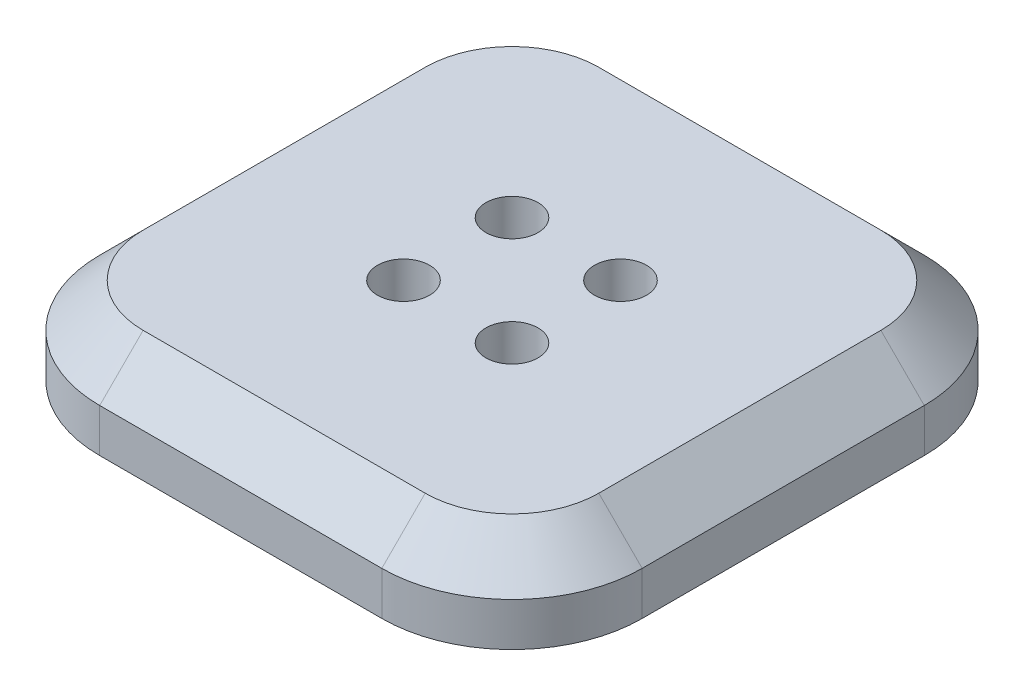
ISO-10303-21;
HEADER;
FILE_DESCRIPTION(('STEP AP214'),'2;1');
FILE_NAME('part.step','',(''),(''),'','','');
FILE_SCHEMA(('AUTOMOTIVE_DESIGN { 1 0 10303 214 1 1 1 1 }'));
ENDSEC;
DATA;
#1=APPLICATION_CONTEXT('core data for automotive mechanical design processes');
#2=APPLICATION_PROTOCOL_DEFINITION('international standard','automotive_design',2000,#1);
#3=PRODUCT_CONTEXT('',#1,'mechanical');
#4=PRODUCT('Part','Part','',(#3));
#5=PRODUCT_RELATED_PRODUCT_CATEGORY('part','',(#4));
#6=PRODUCT_DEFINITION_FORMATION('','',#4);
#7=PRODUCT_DEFINITION_CONTEXT('part definition',#1,'design');
#8=PRODUCT_DEFINITION('design','',#6,#7);
#9=PRODUCT_DEFINITION_SHAPE('','',#8);
#10=(LENGTH_UNIT() NAMED_UNIT(*) SI_UNIT(.MILLI.,.METRE.));
#11=(NAMED_UNIT(*) PLANE_ANGLE_UNIT() SI_UNIT($,.RADIAN.));
#12=(NAMED_UNIT(*) SI_UNIT($,.STERADIAN.) SOLID_ANGLE_UNIT());
#13=UNCERTAINTY_MEASURE_WITH_UNIT(LENGTH_MEASURE(1.E-05),#10,'distance_accuracy_value','');
#14=(GEOMETRIC_REPRESENTATION_CONTEXT(3) GLOBAL_UNCERTAINTY_ASSIGNED_CONTEXT((#13)) GLOBAL_UNIT_ASSIGNED_CONTEXT((#10,
#11,#12)) REPRESENTATION_CONTEXT('',''));
#15=CARTESIAN_POINT('',(0.,0.,0.));
#16=DIRECTION('',(0.,0.,1.));
#17=DIRECTION('',(1.,0.,0.));
#18=AXIS2_PLACEMENT_3D('',#15,#16,#17);
#19=CARTESIAN_POINT('',(62.5,20.,62.5));
#20=DIRECTION('',(-1.,0.,0.));
#21=DIRECTION('',(0.,0.,1.));
#22=AXIS2_PLACEMENT_3D('',#19,#20,#21);
#23=PLANE('',#22);
#24=DIRECTION('',(0.,-1.,0.));
#25=VECTOR('',#24,1.);
#26=CARTESIAN_POINT('',(62.5,20.,-32.5));
#27=LINE('',#26,#25);
#28=CARTESIAN_POINT('',(62.5,0.,-32.5));
#29=VERTEX_POINT('',#28);
#30=CARTESIAN_POINT('',(62.5,9.99999999999994,-32.5));
#31=VERTEX_POINT('',#30);
#32=EDGE_CURVE('E251',#29,#31,#27,.F.);
#33=ORIENTED_EDGE('',*,*,#32,.T.);
#34=DIRECTION('',(0.,0.,1.));
#35=VECTOR('',#34,1.);
#36=CARTESIAN_POINT('',(62.5,9.99999999999994,62.5));
#37=LINE('',#36,#35);
#38=CARTESIAN_POINT('',(62.5,9.99999999999995,32.5));
#39=VERTEX_POINT('',#38);
#40=EDGE_CURVE('E276',#31,#39,#37,.T.);
#41=ORIENTED_EDGE('',*,*,#40,.T.);
#42=DIRECTION('',(0.,-1.,0.));
#43=VECTOR('',#42,1.);
#44=CARTESIAN_POINT('',(62.5,20.,32.5));
#45=LINE('',#44,#43);
#46=CARTESIAN_POINT('',(62.5,0.,32.5));
#47=VERTEX_POINT('',#46);
#48=EDGE_CURVE('E249',#39,#47,#45,.T.);
#49=ORIENTED_EDGE('',*,*,#48,.T.);
#50=DIRECTION('',(0.,0.,-1.));
#51=VECTOR('',#50,1.);
#52=CARTESIAN_POINT('',(62.5,0.,62.5));
#53=LINE('',#52,#51);
#54=EDGE_CURVE('E216',#47,#29,#53,.T.);
#55=ORIENTED_EDGE('',*,*,#54,.T.);
#56=EDGE_LOOP('',(#33,#41,#49,#55));
#57=FACE_BOUND('',#56,.T.);
#58=ADVANCED_FACE('F45',(#57),#23,.F.);
#59=CARTESIAN_POINT('',(-62.5,20.,-62.5));
#60=DIRECTION('',(0.,0.,1.));
#61=DIRECTION('',(1.,0.,0.));
#62=AXIS2_PLACEMENT_3D('',#59,#60,#61);
#63=PLANE('',#62);
#64=DIRECTION('',(0.,-1.,0.));
#65=VECTOR('',#64,1.);
#66=CARTESIAN_POINT('',(-32.5,20.,-62.5));
#67=LINE('',#66,#65);
#68=CARTESIAN_POINT('',(-32.5,0.,-62.5));
#69=VERTEX_POINT('',#68);
#70=CARTESIAN_POINT('',(-32.5,9.99999999999995,-62.5));
#71=VERTEX_POINT('',#70);
#72=EDGE_CURVE('E242',#69,#71,#67,.F.);
#73=ORIENTED_EDGE('',*,*,#72,.T.);
#74=DIRECTION('',(1.,0.,0.));
#75=VECTOR('',#74,1.);
#76=CARTESIAN_POINT('',(-62.5,9.99999999999994,-62.5));
#77=LINE('',#76,#75);
#78=CARTESIAN_POINT('',(32.5,9.99999999999994,-62.5));
#79=VERTEX_POINT('',#78);
#80=EDGE_CURVE('E274',#71,#79,#77,.T.);
#81=ORIENTED_EDGE('',*,*,#80,.T.);
#82=DIRECTION('',(0.,-1.,0.));
#83=VECTOR('',#82,1.);
#84=CARTESIAN_POINT('',(32.5,20.,-62.5));
#85=LINE('',#84,#83);
#86=CARTESIAN_POINT('',(32.5,0.,-62.5));
#87=VERTEX_POINT('',#86);
#88=EDGE_CURVE('E240',#79,#87,#85,.T.);
#89=ORIENTED_EDGE('',*,*,#88,.T.);
#90=DIRECTION('',(-1.,0.,0.));
#91=VECTOR('',#90,1.);
#92=CARTESIAN_POINT('',(-62.5,0.,-62.5));
#93=LINE('',#92,#91);
#94=EDGE_CURVE('E219',#87,#69,#93,.T.);
#95=ORIENTED_EDGE('',*,*,#94,.T.);
#96=EDGE_LOOP('',(#73,#81,#89,#95));
#97=FACE_BOUND('',#96,.T.);
#98=ADVANCED_FACE('F361',(#97),#63,.F.);
#99=CARTESIAN_POINT('',(-62.5,20.,62.5));
#100=DIRECTION('',(1.,0.,0.));
#101=DIRECTION('',(0.,0.,-1.));
#102=AXIS2_PLACEMENT_3D('',#99,#100,#101);
#103=PLANE('',#102);
#104=DIRECTION('',(0.,-1.,0.));
#105=VECTOR('',#104,1.);
#106=CARTESIAN_POINT('',(-62.5,20.,32.5));
#107=LINE('',#106,#105);
#108=CARTESIAN_POINT('',(-62.5,0.,32.5));
#109=VERTEX_POINT('',#108);
#110=CARTESIAN_POINT('',(-62.5,9.99999999999995,32.5));
#111=VERTEX_POINT('',#110);
#112=EDGE_CURVE('E228',#109,#111,#107,.F.);
#113=ORIENTED_EDGE('',*,*,#112,.T.);
#114=DIRECTION('',(0.,0.,-1.));
#115=VECTOR('',#114,1.);
#116=CARTESIAN_POINT('',(-62.5,9.99999999999994,62.5));
#117=LINE('',#116,#115);
#118=CARTESIAN_POINT('',(-62.5,9.99999999999994,-32.5));
#119=VERTEX_POINT('',#118);
#120=EDGE_CURVE('E282',#111,#119,#117,.T.);
#121=ORIENTED_EDGE('',*,*,#120,.T.);
#122=DIRECTION('',(0.,-1.,0.));
#123=VECTOR('',#122,1.);
#124=CARTESIAN_POINT('',(-62.5,20.,-32.5));
#125=LINE('',#124,#123);
#126=CARTESIAN_POINT('',(-62.5,0.,-32.5));
#127=VERTEX_POINT('',#126);
#128=EDGE_CURVE('E230',#119,#127,#125,.T.);
#129=ORIENTED_EDGE('',*,*,#128,.T.);
#130=DIRECTION('',(0.,0.,1.));
#131=VECTOR('',#130,1.);
#132=CARTESIAN_POINT('',(-62.5,0.,62.5));
#133=LINE('',#132,#131);
#134=EDGE_CURVE('E222',#127,#109,#133,.T.);
#135=ORIENTED_EDGE('',*,*,#134,.T.);
#136=EDGE_LOOP('',(#113,#121,#129,#135));
#137=FACE_BOUND('',#136,.T.);
#138=ADVANCED_FACE('F318',(#137),#103,.F.);
#139=CARTESIAN_POINT('',(-62.5,20.,62.5));
#140=DIRECTION('',(0.,0.,-1.));
#141=DIRECTION('',(-1.,0.,0.));
#142=AXIS2_PLACEMENT_3D('',#139,#140,#141);
#143=PLANE('',#142);
#144=DIRECTION('',(0.,-1.,0.));
#145=VECTOR('',#144,1.);
#146=CARTESIAN_POINT('',(32.5,20.,62.5));
#147=LINE('',#146,#145);
#148=CARTESIAN_POINT('',(32.5,0.,62.5));
#149=VERTEX_POINT('',#148);
#150=CARTESIAN_POINT('',(32.5,9.99999999999994,62.5));
#151=VERTEX_POINT('',#150);
#152=EDGE_CURVE('E245',#149,#151,#147,.F.);
#153=ORIENTED_EDGE('',*,*,#152,.T.);
#154=DIRECTION('',(-1.,0.,0.));
#155=VECTOR('',#154,1.);
#156=CARTESIAN_POINT('',(-62.5,9.99999999999994,62.5));
#157=LINE('',#156,#155);
#158=CARTESIAN_POINT('',(-32.5,9.99999999999995,62.5));
#159=VERTEX_POINT('',#158);
#160=EDGE_CURVE('E55',#151,#159,#157,.T.);
#161=ORIENTED_EDGE('',*,*,#160,.T.);
#162=DIRECTION('',(0.,-1.,0.));
#163=VECTOR('',#162,1.);
#164=CARTESIAN_POINT('',(-32.5,20.,62.5));
#165=LINE('',#164,#163);
#166=CARTESIAN_POINT('',(-32.5,0.,62.5));
#167=VERTEX_POINT('',#166);
#168=EDGE_CURVE('E247',#159,#167,#165,.T.);
#169=ORIENTED_EDGE('',*,*,#168,.T.);
#170=DIRECTION('',(1.,0.,0.));
#171=VECTOR('',#170,1.);
#172=CARTESIAN_POINT('',(-62.5,0.,62.5));
#173=LINE('',#172,#171);
#174=EDGE_CURVE('E225',#167,#149,#173,.T.);
#175=ORIENTED_EDGE('',*,*,#174,.T.);
#176=EDGE_LOOP('',(#153,#161,#169,#175));
#177=FACE_BOUND('',#176,.T.);
#178=ADVANCED_FACE('F333',(#177),#143,.F.);
#179=CARTESIAN_POINT('',(0.,20.,0.));
#180=DIRECTION('',(0.,-1.,0.));
#181=DIRECTION('',(0.,0.,-1.));
#182=AXIS2_PLACEMENT_3D('',#179,#180,#181);
#183=PLANE('',#182);
#184=CARTESIAN_POINT('',(-12.5,20.,-12.5));
#185=DIRECTION('',(0.,1.,0.));
#186=DIRECTION('',(0.,0.,1.));
#187=AXIS2_PLACEMENT_3D('',#184,#185,#186);
#188=CIRCLE('',#187,6.);
#189=CARTESIAN_POINT('',(-12.5,20.,-6.5));
#190=VERTEX_POINT('',#189);
#191=EDGE_CURVE('E169',#190,#190,#188,.T.);
#192=ORIENTED_EDGE('',*,*,#191,.F.);
#193=EDGE_LOOP('',(#192));
#194=FACE_BOUND('',#193,.T.);
#195=CARTESIAN_POINT('',(12.5,20.,-12.5));
#196=DIRECTION('',(0.,1.,0.));
#197=DIRECTION('',(0.,0.,1.));
#198=AXIS2_PLACEMENT_3D('',#195,#196,#197);
#199=CIRCLE('',#198,6.);
#200=CARTESIAN_POINT('',(12.5,20.,-6.50000000000001));
#201=VERTEX_POINT('',#200);
#202=EDGE_CURVE('E168',#201,#201,#199,.T.);
#203=ORIENTED_EDGE('',*,*,#202,.F.);
#204=EDGE_LOOP('',(#203));
#205=FACE_BOUND('',#204,.T.);
#206=CARTESIAN_POINT('',(12.5,20.,12.5));
#207=DIRECTION('',(0.,1.,0.));
#208=DIRECTION('',(0.,0.,1.));
#209=AXIS2_PLACEMENT_3D('',#206,#207,#208);
#210=CIRCLE('',#209,6.);
#211=CARTESIAN_POINT('',(12.5,20.,18.5));
#212=VERTEX_POINT('',#211);
#213=EDGE_CURVE('E179',#212,#212,#210,.T.);
#214=ORIENTED_EDGE('',*,*,#213,.F.);
#215=EDGE_LOOP('',(#214));
#216=FACE_BOUND('',#215,.T.);
#217=CARTESIAN_POINT('',(-12.5,20.,12.5));
#218=DIRECTION('',(0.,1.,0.));
#219=DIRECTION('',(0.,0.,1.));
#220=AXIS2_PLACEMENT_3D('',#217,#218,#219);
#221=CIRCLE('',#220,6.);
#222=CARTESIAN_POINT('',(-12.5,20.,18.5));
#223=VERTEX_POINT('',#222);
#224=EDGE_CURVE('E185',#223,#223,#221,.T.);
#225=ORIENTED_EDGE('',*,*,#224,.F.);
#226=EDGE_LOOP('',(#225));
#227=FACE_BOUND('',#226,.T.);
#228=DIRECTION('',(0.,0.,-1.));
#229=VECTOR('',#228,1.);
#230=CARTESIAN_POINT('',(52.5,20.,0.));
#231=LINE('',#230,#229);
#232=CARTESIAN_POINT('',(52.5,20.,32.5));
#233=VERTEX_POINT('',#232);
#234=CARTESIAN_POINT('',(52.5,20.,-32.5));
#235=VERTEX_POINT('',#234);
#236=EDGE_CURVE('E264',#233,#235,#231,.T.);
#237=ORIENTED_EDGE('',*,*,#236,.T.);
#238=CARTESIAN_POINT('',(32.5,20.,-32.5));
#239=DIRECTION('',(0.,-1.,0.));
#240=DIRECTION('',(0.,0.,-1.));
#241=AXIS2_PLACEMENT_3D('',#238,#239,#240);
#242=CIRCLE('',#241,20.);
#243=CARTESIAN_POINT('',(32.5,20.,-52.5));
#244=VERTEX_POINT('',#243);
#245=EDGE_CURVE('E268',#235,#244,#242,.F.);
#246=ORIENTED_EDGE('',*,*,#245,.T.);
#247=DIRECTION('',(-1.,0.,0.));
#248=VECTOR('',#247,1.);
#249=CARTESIAN_POINT('',(0.,20.,-52.5));
#250=LINE('',#249,#248);
#251=CARTESIAN_POINT('',(-32.5,20.,-52.5));
#252=VERTEX_POINT('',#251);
#253=EDGE_CURVE('E266',#244,#252,#250,.T.);
#254=ORIENTED_EDGE('',*,*,#253,.T.);
#255=CARTESIAN_POINT('',(-32.5,20.,-32.5));
#256=DIRECTION('',(0.,-1.,0.));
#257=DIRECTION('',(0.,0.,-1.));
#258=AXIS2_PLACEMENT_3D('',#255,#256,#257);
#259=CIRCLE('',#258,20.);
#260=CARTESIAN_POINT('',(-52.5,20.,-32.5));
#261=VERTEX_POINT('',#260);
#262=EDGE_CURVE('E262',#252,#261,#259,.F.);
#263=ORIENTED_EDGE('',*,*,#262,.T.);
#264=DIRECTION('',(0.,0.,1.));
#265=VECTOR('',#264,1.);
#266=CARTESIAN_POINT('',(-52.5,20.,0.));
#267=LINE('',#266,#265);
#268=CARTESIAN_POINT('',(-52.5,20.,32.5));
#269=VERTEX_POINT('',#268);
#270=EDGE_CURVE('E258',#261,#269,#267,.T.);
#271=ORIENTED_EDGE('',*,*,#270,.T.);
#272=CARTESIAN_POINT('',(-32.5,20.,32.5));
#273=DIRECTION('',(0.,-1.,0.));
#274=DIRECTION('',(0.,0.,-1.));
#275=AXIS2_PLACEMENT_3D('',#272,#273,#274);
#276=CIRCLE('',#275,20.);
#277=CARTESIAN_POINT('',(-32.5,20.,52.5));
#278=VERTEX_POINT('',#277);
#279=EDGE_CURVE('E254',#269,#278,#276,.F.);
#280=ORIENTED_EDGE('',*,*,#279,.T.);
#281=DIRECTION('',(1.,0.,0.));
#282=VECTOR('',#281,1.);
#283=CARTESIAN_POINT('',(0.,20.,52.5));
#284=LINE('',#283,#282);
#285=CARTESIAN_POINT('',(32.5,20.,52.5));
#286=VERTEX_POINT('',#285);
#287=EDGE_CURVE('E256',#278,#286,#284,.T.);
#288=ORIENTED_EDGE('',*,*,#287,.T.);
#289=CARTESIAN_POINT('',(32.5,20.,32.5));
#290=DIRECTION('',(0.,-1.,0.));
#291=DIRECTION('',(0.,0.,-1.));
#292=AXIS2_PLACEMENT_3D('',#289,#290,#291);
#293=CIRCLE('',#292,20.);
#294=EDGE_CURVE('E260',#286,#233,#293,.F.);
#295=ORIENTED_EDGE('',*,*,#294,.T.);
#296=EDGE_LOOP('',(#237,#246,#254,#263,#271,#280,#288,#295));
#297=FACE_BOUND('',#296,.T.);
#298=ADVANCED_FACE('F349',(#194,#205,#216,#227,#297),#183,.F.);
#299=CARTESIAN_POINT('',(0.,0.,0.));
#300=DIRECTION('',(0.,-1.,0.));
#301=DIRECTION('',(0.,0.,-1.));
#302=AXIS2_PLACEMENT_3D('',#299,#300,#301);
#303=PLANE('',#302);
#304=CARTESIAN_POINT('',(37.5,0.,-37.5));
#305=DIRECTION('',(0.,-1.,0.));
#306=DIRECTION('',(0.,0.,-1.));
#307=AXIS2_PLACEMENT_3D('',#304,#305,#306);
#308=CIRCLE('',#307,6.);
#309=CARTESIAN_POINT('',(37.5,0.,-43.5));
#310=VERTEX_POINT('',#309);
#311=EDGE_CURVE('E191',#310,#310,#308,.T.);
#312=ORIENTED_EDGE('',*,*,#311,.F.);
#313=EDGE_LOOP('',(#312));
#314=FACE_BOUND('',#313,.T.);
#315=CARTESIAN_POINT('',(-37.5,0.,-37.5));
#316=DIRECTION('',(0.,-1.,0.));
#317=DIRECTION('',(0.,0.,-1.));
#318=AXIS2_PLACEMENT_3D('',#315,#316,#317);
#319=CIRCLE('',#318,6.);
#320=CARTESIAN_POINT('',(-37.5,0.,-43.5));
#321=VERTEX_POINT('',#320);
#322=EDGE_CURVE('E197',#321,#321,#319,.T.);
#323=ORIENTED_EDGE('',*,*,#322,.F.);
#324=EDGE_LOOP('',(#323));
#325=FACE_BOUND('',#324,.T.);
#326=CARTESIAN_POINT('',(-37.5,0.,37.5));
#327=DIRECTION('',(0.,-1.,0.));
#328=DIRECTION('',(0.,0.,-1.));
#329=AXIS2_PLACEMENT_3D('',#326,#327,#328);
#330=CIRCLE('',#329,6.);
#331=CARTESIAN_POINT('',(-37.5,0.,31.5));
#332=VERTEX_POINT('',#331);
#333=EDGE_CURVE('E203',#332,#332,#330,.T.);
#334=ORIENTED_EDGE('',*,*,#333,.F.);
#335=EDGE_LOOP('',(#334));
#336=FACE_BOUND('',#335,.T.);
#337=CARTESIAN_POINT('',(37.5,0.,37.5));
#338=DIRECTION('',(0.,-1.,0.));
#339=DIRECTION('',(0.,0.,-1.));
#340=AXIS2_PLACEMENT_3D('',#337,#338,#339);
#341=CIRCLE('',#340,6.);
#342=CARTESIAN_POINT('',(37.5,0.,31.5));
#343=VERTEX_POINT('',#342);
#344=EDGE_CURVE('E209',#343,#343,#341,.T.);
#345=ORIENTED_EDGE('',*,*,#344,.F.);
#346=EDGE_LOOP('',(#345));
#347=FACE_BOUND('',#346,.T.);
#348=ORIENTED_EDGE('',*,*,#134,.F.);
#349=CARTESIAN_POINT('',(-32.5,0.,-32.5));
#350=DIRECTION('',(0.,-1.,0.));
#351=DIRECTION('',(0.,0.,-1.));
#352=AXIS2_PLACEMENT_3D('',#349,#350,#351);
#353=CIRCLE('',#352,30.);
#354=EDGE_CURVE('E238',#127,#69,#353,.T.);
#355=ORIENTED_EDGE('',*,*,#354,.T.);
#356=ORIENTED_EDGE('',*,*,#94,.F.);
#357=CARTESIAN_POINT('',(32.5,0.,-32.5));
#358=DIRECTION('',(0.,-1.,0.));
#359=DIRECTION('',(0.,0.,-1.));
#360=AXIS2_PLACEMENT_3D('',#357,#358,#359);
#361=CIRCLE('',#360,30.);
#362=EDGE_CURVE('E234',#87,#29,#361,.T.);
#363=ORIENTED_EDGE('',*,*,#362,.T.);
#364=ORIENTED_EDGE('',*,*,#54,.F.);
#365=CARTESIAN_POINT('',(32.5,0.,32.5));
#366=DIRECTION('',(0.,-1.,0.));
#367=DIRECTION('',(0.,0.,-1.));
#368=AXIS2_PLACEMENT_3D('',#365,#366,#367);
#369=CIRCLE('',#368,30.);
#370=EDGE_CURVE('E232',#47,#149,#369,.T.);
#371=ORIENTED_EDGE('',*,*,#370,.T.);
#372=ORIENTED_EDGE('',*,*,#174,.F.);
#373=CARTESIAN_POINT('',(-32.5,0.,32.5));
#374=DIRECTION('',(0.,-1.,0.));
#375=DIRECTION('',(0.,0.,-1.));
#376=AXIS2_PLACEMENT_3D('',#373,#374,#375);
#377=CIRCLE('',#376,30.);
#378=EDGE_CURVE('E236',#167,#109,#377,.T.);
#379=ORIENTED_EDGE('',*,*,#378,.T.);
#380=EDGE_LOOP('',(#348,#355,#356,#363,#364,#371,#372,#379));
#381=FACE_BOUND('',#380,.T.);
#382=ADVANCED_FACE('F326',(#314,#325,#336,#347,#381),#303,.T.);
#383=CARTESIAN_POINT('',(-32.5,20.,-32.5));
#384=DIRECTION('',(0.,-1.,0.));
#385=DIRECTION('',(0.,0.,-1.));
#386=AXIS2_PLACEMENT_3D('',#383,#384,#385);
#387=CYLINDRICAL_SURFACE('',#386,30.);
#388=ORIENTED_EDGE('',*,*,#128,.F.);
#389=CARTESIAN_POINT('',(-32.5,9.99999999999995,-32.5));
#390=DIRECTION('',(0.,-1.,0.));
#391=DIRECTION('',(0.,0.,-1.));
#392=AXIS2_PLACEMENT_3D('',#389,#390,#391);
#393=CIRCLE('',#392,30.);
#394=EDGE_CURVE('E278',#119,#71,#393,.T.);
#395=ORIENTED_EDGE('',*,*,#394,.T.);
#396=ORIENTED_EDGE('',*,*,#72,.F.);
#397=ORIENTED_EDGE('',*,*,#354,.F.);
#398=EDGE_LOOP('',(#388,#395,#396,#397));
#399=FACE_BOUND('',#398,.T.);
#400=ADVANCED_FACE('F321',(#399),#387,.T.);
#401=CARTESIAN_POINT('',(-32.5,20.,32.5));
#402=DIRECTION('',(0.,-1.,0.));
#403=DIRECTION('',(0.,0.,-1.));
#404=AXIS2_PLACEMENT_3D('',#401,#402,#403);
#405=CYLINDRICAL_SURFACE('',#404,30.);
#406=ORIENTED_EDGE('',*,*,#168,.F.);
#407=CARTESIAN_POINT('',(-32.5,9.99999999999995,32.5));
#408=DIRECTION('',(0.,-1.,0.));
#409=DIRECTION('',(0.,0.,-1.));
#410=AXIS2_PLACEMENT_3D('',#407,#408,#409);
#411=CIRCLE('',#410,30.);
#412=EDGE_CURVE('E11',#159,#111,#411,.T.);
#413=ORIENTED_EDGE('',*,*,#412,.T.);
#414=ORIENTED_EDGE('',*,*,#112,.F.);
#415=ORIENTED_EDGE('',*,*,#378,.F.);
#416=EDGE_LOOP('',(#406,#413,#414,#415));
#417=FACE_BOUND('',#416,.T.);
#418=ADVANCED_FACE('F329',(#417),#405,.T.);
#419=CARTESIAN_POINT('',(32.5,20.,-32.5));
#420=DIRECTION('',(0.,-1.,0.));
#421=DIRECTION('',(0.,0.,-1.));
#422=AXIS2_PLACEMENT_3D('',#419,#420,#421);
#423=CYLINDRICAL_SURFACE('',#422,30.);
#424=ORIENTED_EDGE('',*,*,#88,.F.);
#425=CARTESIAN_POINT('',(32.5,9.99999999999995,-32.5));
#426=DIRECTION('',(0.,-1.,0.));
#427=DIRECTION('',(0.,0.,-1.));
#428=AXIS2_PLACEMENT_3D('',#425,#426,#427);
#429=CIRCLE('',#428,30.);
#430=EDGE_CURVE('E271',#79,#31,#429,.T.);
#431=ORIENTED_EDGE('',*,*,#430,.T.);
#432=ORIENTED_EDGE('',*,*,#32,.F.);
#433=ORIENTED_EDGE('',*,*,#362,.F.);
#434=EDGE_LOOP('',(#424,#431,#432,#433));
#435=FACE_BOUND('',#434,.T.);
#436=ADVANCED_FACE('F365',(#435),#423,.T.);
#437=CARTESIAN_POINT('',(32.5,20.,32.5));
#438=DIRECTION('',(0.,-1.,0.));
#439=DIRECTION('',(0.,0.,-1.));
#440=AXIS2_PLACEMENT_3D('',#437,#438,#439);
#441=CYLINDRICAL_SURFACE('',#440,30.);
#442=ORIENTED_EDGE('',*,*,#48,.F.);
#443=CARTESIAN_POINT('',(32.5,9.99999999999995,32.5));
#444=DIRECTION('',(0.,-1.,0.));
#445=DIRECTION('',(0.,0.,-1.));
#446=AXIS2_PLACEMENT_3D('',#443,#444,#445);
#447=CIRCLE('',#446,30.);
#448=EDGE_CURVE('E280',#39,#151,#447,.T.);
#449=ORIENTED_EDGE('',*,*,#448,.T.);
#450=ORIENTED_EDGE('',*,*,#152,.F.);
#451=ORIENTED_EDGE('',*,*,#370,.F.);
#452=EDGE_LOOP('',(#442,#449,#450,#451));
#453=FACE_BOUND('',#452,.T.);
#454=ADVANCED_FACE('F336',(#453),#441,.T.);
#455=CARTESIAN_POINT('',(-32.5,20.,32.5));
#456=DIRECTION('',(0.,-1.,0.));
#457=DIRECTION('',(0.,0.,-1.));
#458=AXIS2_PLACEMENT_3D('',#455,#456,#457);
#459=CONICAL_SURFACE('',#458,20.,0.785398163397446);
#460=DIRECTION('',(0.707106781186546,0.707106781186549,0.));
#461=VECTOR('',#460,1.);
#462=CARTESIAN_POINT('',(-62.5,9.99999999999995,32.5));
#463=LINE('',#462,#461);
#464=EDGE_CURVE('E299',#111,#269,#463,.T.);
#465=ORIENTED_EDGE('',*,*,#464,.F.);
#466=ORIENTED_EDGE('',*,*,#412,.F.);
#467=DIRECTION('',(0.,-0.707106781186549,0.707106781186546));
#468=VECTOR('',#467,1.);
#469=CARTESIAN_POINT('',(-32.5,20.,52.5));
#470=LINE('',#469,#468);
#471=EDGE_CURVE('E50',#278,#159,#470,.T.);
#472=ORIENTED_EDGE('',*,*,#471,.F.);
#473=ORIENTED_EDGE('',*,*,#279,.F.);
#474=EDGE_LOOP('',(#465,#466,#472,#473));
#475=FACE_BOUND('',#474,.T.);
#476=ADVANCED_FACE('F48',(#475),#459,.T.);
#477=CARTESIAN_POINT('',(0.,20.,52.5));
#478=DIRECTION('',(0.,-0.707106781186546,-0.707106781186549));
#479=DIRECTION('',(1.,0.,0.));
#480=AXIS2_PLACEMENT_3D('',#477,#478,#479);
#481=PLANE('',#480);
#482=ORIENTED_EDGE('',*,*,#471,.T.);
#483=ORIENTED_EDGE('',*,*,#160,.F.);
#484=DIRECTION('',(0.,-0.707106781186549,0.707106781186546));
#485=VECTOR('',#484,1.);
#486=CARTESIAN_POINT('',(32.5,20.,52.5));
#487=LINE('',#486,#485);
#488=EDGE_CURVE('E297',#286,#151,#487,.T.);
#489=ORIENTED_EDGE('',*,*,#488,.F.);
#490=ORIENTED_EDGE('',*,*,#287,.F.);
#491=EDGE_LOOP('',(#482,#483,#489,#490));
#492=FACE_BOUND('',#491,.T.);
#493=ADVANCED_FACE('F309',(#492),#481,.F.);
#494=CARTESIAN_POINT('',(-52.5,20.,0.));
#495=DIRECTION('',(0.707106781186549,-0.707106781186546,0.));
#496=DIRECTION('',(0.,0.,1.));
#497=AXIS2_PLACEMENT_3D('',#494,#495,#496);
#498=PLANE('',#497);
#499=ORIENTED_EDGE('',*,*,#464,.T.);
#500=ORIENTED_EDGE('',*,*,#270,.F.);
#501=DIRECTION('',(0.707106781186546,0.707106781186549,0.));
#502=VECTOR('',#501,1.);
#503=CARTESIAN_POINT('',(-62.5,9.99999999999994,-32.5));
#504=LINE('',#503,#502);
#505=EDGE_CURVE('E294',#119,#261,#504,.T.);
#506=ORIENTED_EDGE('',*,*,#505,.F.);
#507=ORIENTED_EDGE('',*,*,#120,.F.);
#508=EDGE_LOOP('',(#499,#500,#506,#507));
#509=FACE_BOUND('',#508,.T.);
#510=ADVANCED_FACE('F314',(#509),#498,.F.);
#511=CARTESIAN_POINT('',(32.5,20.,32.5));
#512=DIRECTION('',(0.,-1.,0.));
#513=DIRECTION('',(0.,0.,-1.));
#514=AXIS2_PLACEMENT_3D('',#511,#512,#513);
#515=CONICAL_SURFACE('',#514,20.,0.785398163397446);
#516=ORIENTED_EDGE('',*,*,#488,.T.);
#517=ORIENTED_EDGE('',*,*,#448,.F.);
#518=DIRECTION('',(0.707106781186546,-0.707106781186549,0.));
#519=VECTOR('',#518,1.);
#520=CARTESIAN_POINT('',(52.5,20.,32.5));
#521=LINE('',#520,#519);
#522=EDGE_CURVE('E291',#233,#39,#521,.T.);
#523=ORIENTED_EDGE('',*,*,#522,.F.);
#524=ORIENTED_EDGE('',*,*,#294,.F.);
#525=EDGE_LOOP('',(#516,#517,#523,#524));
#526=FACE_BOUND('',#525,.T.);
#527=ADVANCED_FACE('F340',(#526),#515,.T.);
#528=CARTESIAN_POINT('',(-32.5,20.,-32.5));
#529=DIRECTION('',(0.,-1.,0.));
#530=DIRECTION('',(0.,0.,-1.));
#531=AXIS2_PLACEMENT_3D('',#528,#529,#530);
#532=CONICAL_SURFACE('',#531,20.,0.785398163397446);
#533=ORIENTED_EDGE('',*,*,#505,.T.);
#534=ORIENTED_EDGE('',*,*,#262,.F.);
#535=DIRECTION('',(0.,0.707106781186549,0.707106781186546));
#536=VECTOR('',#535,1.);
#537=CARTESIAN_POINT('',(-32.5,9.99999999999995,-62.5));
#538=LINE('',#537,#536);
#539=EDGE_CURVE('E288',#71,#252,#538,.T.);
#540=ORIENTED_EDGE('',*,*,#539,.F.);
#541=ORIENTED_EDGE('',*,*,#394,.F.);
#542=EDGE_LOOP('',(#533,#534,#540,#541));
#543=FACE_BOUND('',#542,.T.);
#544=ADVANCED_FACE('F352',(#543),#532,.T.);
#545=CARTESIAN_POINT('',(52.5,20.,0.));
#546=DIRECTION('',(-0.707106781186549,-0.707106781186546,0.));
#547=DIRECTION('',(0.,0.,-1.));
#548=AXIS2_PLACEMENT_3D('',#545,#546,#547);
#549=PLANE('',#548);
#550=ORIENTED_EDGE('',*,*,#522,.T.);
#551=ORIENTED_EDGE('',*,*,#40,.F.);
#552=DIRECTION('',(0.707106781186546,-0.707106781186549,0.));
#553=VECTOR('',#552,1.);
#554=CARTESIAN_POINT('',(52.5,20.,-32.5));
#555=LINE('',#554,#553);
#556=EDGE_CURVE('E286',#235,#31,#555,.T.);
#557=ORIENTED_EDGE('',*,*,#556,.F.);
#558=ORIENTED_EDGE('',*,*,#236,.F.);
#559=EDGE_LOOP('',(#550,#551,#557,#558));
#560=FACE_BOUND('',#559,.T.);
#561=ADVANCED_FACE('F345',(#560),#549,.F.);
#562=CARTESIAN_POINT('',(0.,20.,-52.5));
#563=DIRECTION('',(0.,-0.707106781186546,0.707106781186549));
#564=DIRECTION('',(-1.,0.,0.));
#565=AXIS2_PLACEMENT_3D('',#562,#563,#564);
#566=PLANE('',#565);
#567=ORIENTED_EDGE('',*,*,#539,.T.);
#568=ORIENTED_EDGE('',*,*,#253,.F.);
#569=DIRECTION('',(0.,0.707106781186549,0.707106781186546));
#570=VECTOR('',#569,1.);
#571=CARTESIAN_POINT('',(32.5,9.99999999999994,-62.5));
#572=LINE('',#571,#570);
#573=EDGE_CURVE('E215',#79,#244,#572,.T.);
#574=ORIENTED_EDGE('',*,*,#573,.F.);
#575=ORIENTED_EDGE('',*,*,#80,.F.);
#576=EDGE_LOOP('',(#567,#568,#574,#575));
#577=FACE_BOUND('',#576,.T.);
#578=ADVANCED_FACE('F358',(#577),#566,.F.);
#579=CARTESIAN_POINT('',(32.5,20.,-32.5));
#580=DIRECTION('',(0.,-1.,0.));
#581=DIRECTION('',(0.,0.,-1.));
#582=AXIS2_PLACEMENT_3D('',#579,#580,#581);
#583=CONICAL_SURFACE('',#582,20.,0.785398163397446);
#584=ORIENTED_EDGE('',*,*,#556,.T.);
#585=ORIENTED_EDGE('',*,*,#430,.F.);
#586=ORIENTED_EDGE('',*,*,#573,.T.);
#587=ORIENTED_EDGE('',*,*,#245,.F.);
#588=EDGE_LOOP('',(#584,#585,#586,#587));
#589=FACE_BOUND('',#588,.T.);
#590=ADVANCED_FACE('F368',(#589),#583,.T.);
#591=CARTESIAN_POINT('',(37.5,9.99999999999999,37.5));
#592=DIRECTION('',(0.,-1.,0.));
#593=DIRECTION('',(0.,0.,-1.));
#594=AXIS2_PLACEMENT_3D('',#591,#592,#593);
#595=CONICAL_SURFACE('',#594,6.,1.02974425867666);
#596=CARTESIAN_POINT('',(37.5,13.6051637141653,37.5));
#597=VERTEX_POINT('',#596);
#598=VERTEX_LOOP('',#597);
#599=FACE_BOUND('',#598,.T.);
#600=CARTESIAN_POINT('',(37.5,9.99999999999999,37.5));
#601=DIRECTION('',(0.,-1.,0.));
#602=DIRECTION('',(0.,0.,-1.));
#603=AXIS2_PLACEMENT_3D('',#600,#601,#602);
#604=CIRCLE('',#603,6.);
#605=CARTESIAN_POINT('',(37.5,9.99999999999999,31.5));
#606=VERTEX_POINT('',#605);
#607=EDGE_CURVE('E212',#606,#606,#604,.T.);
#608=ORIENTED_EDGE('',*,*,#607,.T.);
#609=EDGE_LOOP('',(#608));
#610=FACE_BOUND('',#609,.T.);
#611=ADVANCED_FACE('F370',(#599,#610),#595,.F.);
#612=CARTESIAN_POINT('',(37.5,0.,37.5));
#613=DIRECTION('',(0.,-1.,0.));
#614=DIRECTION('',(0.,0.,-1.));
#615=AXIS2_PLACEMENT_3D('',#612,#613,#614);
#616=CYLINDRICAL_SURFACE('',#615,6.);
#617=ORIENTED_EDGE('',*,*,#607,.F.);
#618=EDGE_LOOP('',(#617));
#619=FACE_BOUND('',#618,.T.);
#620=ORIENTED_EDGE('',*,*,#344,.T.);
#621=EDGE_LOOP('',(#620));
#622=FACE_BOUND('',#621,.T.);
#623=ADVANCED_FACE('F376',(#619,#622),#616,.F.);
#624=CARTESIAN_POINT('',(-37.5,9.99999999999999,37.5));
#625=DIRECTION('',(0.,-1.,0.));
#626=DIRECTION('',(0.,0.,-1.));
#627=AXIS2_PLACEMENT_3D('',#624,#625,#626);
#628=CONICAL_SURFACE('',#627,6.,1.02974425867666);
#629=CARTESIAN_POINT('',(-37.5,13.6051637141653,37.5));
#630=VERTEX_POINT('',#629);
#631=VERTEX_LOOP('',#630);
#632=FACE_BOUND('',#631,.T.);
#633=CARTESIAN_POINT('',(-37.5,9.99999999999999,37.5));
#634=DIRECTION('',(0.,-1.,0.));
#635=DIRECTION('',(0.,0.,-1.));
#636=AXIS2_PLACEMENT_3D('',#633,#634,#635);
#637=CIRCLE('',#636,6.);
#638=CARTESIAN_POINT('',(-37.5,9.99999999999999,31.5));
#639=VERTEX_POINT('',#638);
#640=EDGE_CURVE('E206',#639,#639,#637,.T.);
#641=ORIENTED_EDGE('',*,*,#640,.T.);
#642=EDGE_LOOP('',(#641));
#643=FACE_BOUND('',#642,.T.);
#644=ADVANCED_FACE('F472',(#632,#643),#628,.F.);
#645=CARTESIAN_POINT('',(-37.5,0.,37.5));
#646=DIRECTION('',(0.,-1.,0.));
#647=DIRECTION('',(0.,0.,-1.));
#648=AXIS2_PLACEMENT_3D('',#645,#646,#647);
#649=CYLINDRICAL_SURFACE('',#648,6.);
#650=ORIENTED_EDGE('',*,*,#640,.F.);
#651=EDGE_LOOP('',(#650));
#652=FACE_BOUND('',#651,.T.);
#653=ORIENTED_EDGE('',*,*,#333,.T.);
#654=EDGE_LOOP('',(#653));
#655=FACE_BOUND('',#654,.T.);
#656=ADVANCED_FACE('F482',(#652,#655),#649,.F.);
#657=CARTESIAN_POINT('',(-37.5,9.99999999999999,-37.5));
#658=DIRECTION('',(0.,-1.,0.));
#659=DIRECTION('',(0.,0.,-1.));
#660=AXIS2_PLACEMENT_3D('',#657,#658,#659);
#661=CONICAL_SURFACE('',#660,6.,1.02974425867666);
#662=CARTESIAN_POINT('',(-37.5,13.6051637141653,-37.5));
#663=VERTEX_POINT('',#662);
#664=VERTEX_LOOP('',#663);
#665=FACE_BOUND('',#664,.T.);
#666=CARTESIAN_POINT('',(-37.5,9.99999999999999,-37.5));
#667=DIRECTION('',(0.,-1.,0.));
#668=DIRECTION('',(0.,0.,-1.));
#669=AXIS2_PLACEMENT_3D('',#666,#667,#668);
#670=CIRCLE('',#669,6.);
#671=CARTESIAN_POINT('',(-37.5,9.99999999999999,-43.5));
#672=VERTEX_POINT('',#671);
#673=EDGE_CURVE('E200',#672,#672,#670,.T.);
#674=ORIENTED_EDGE('',*,*,#673,.T.);
#675=EDGE_LOOP('',(#674));
#676=FACE_BOUND('',#675,.T.);
#677=ADVANCED_FACE('F492',(#665,#676),#661,.F.);
#678=CARTESIAN_POINT('',(-37.5,0.,-37.5));
#679=DIRECTION('',(0.,-1.,0.));
#680=DIRECTION('',(0.,0.,-1.));
#681=AXIS2_PLACEMENT_3D('',#678,#679,#680);
#682=CYLINDRICAL_SURFACE('',#681,6.);
#683=ORIENTED_EDGE('',*,*,#673,.F.);
#684=EDGE_LOOP('',(#683));
#685=FACE_BOUND('',#684,.T.);
#686=ORIENTED_EDGE('',*,*,#322,.T.);
#687=EDGE_LOOP('',(#686));
#688=FACE_BOUND('',#687,.T.);
#689=ADVANCED_FACE('F502',(#685,#688),#682,.F.);
#690=CARTESIAN_POINT('',(37.5,9.99999999999999,-37.5));
#691=DIRECTION('',(0.,-1.,0.));
#692=DIRECTION('',(0.,0.,-1.));
#693=AXIS2_PLACEMENT_3D('',#690,#691,#692);
#694=CONICAL_SURFACE('',#693,6.,1.02974425867666);
#695=CARTESIAN_POINT('',(37.5,13.6051637141653,-37.5));
#696=VERTEX_POINT('',#695);
#697=VERTEX_LOOP('',#696);
#698=FACE_BOUND('',#697,.T.);
#699=CARTESIAN_POINT('',(37.5,9.99999999999999,-37.5));
#700=DIRECTION('',(0.,-1.,0.));
#701=DIRECTION('',(0.,0.,-1.));
#702=AXIS2_PLACEMENT_3D('',#699,#700,#701);
#703=CIRCLE('',#702,6.);
#704=CARTESIAN_POINT('',(37.5,9.99999999999999,-43.5));
#705=VERTEX_POINT('',#704);
#706=EDGE_CURVE('E194',#705,#705,#703,.T.);
#707=ORIENTED_EDGE('',*,*,#706,.T.);
#708=EDGE_LOOP('',(#707));
#709=FACE_BOUND('',#708,.T.);
#710=ADVANCED_FACE('F512',(#698,#709),#694,.F.);
#711=CARTESIAN_POINT('',(37.5,0.,-37.5));
#712=DIRECTION('',(0.,-1.,0.));
#713=DIRECTION('',(0.,0.,-1.));
#714=AXIS2_PLACEMENT_3D('',#711,#712,#713);
#715=CYLINDRICAL_SURFACE('',#714,6.);
#716=ORIENTED_EDGE('',*,*,#706,.F.);
#717=EDGE_LOOP('',(#716));
#718=FACE_BOUND('',#717,.T.);
#719=ORIENTED_EDGE('',*,*,#311,.T.);
#720=EDGE_LOOP('',(#719));
#721=FACE_BOUND('',#720,.T.);
#722=ADVANCED_FACE('F522',(#718,#721),#715,.F.);
#723=CARTESIAN_POINT('',(-12.5,10.,12.5));
#724=DIRECTION('',(0.,1.,0.));
#725=DIRECTION('',(0.,0.,1.));
#726=AXIS2_PLACEMENT_3D('',#723,#724,#725);
#727=CONICAL_SURFACE('',#726,6.,1.02974425867666);
#728=CARTESIAN_POINT('',(-12.5,6.39483628583466,12.5));
#729=VERTEX_POINT('',#728);
#730=VERTEX_LOOP('',#729);
#731=FACE_BOUND('',#730,.T.);
#732=CARTESIAN_POINT('',(-12.5,10.,12.5));
#733=DIRECTION('',(0.,1.,0.));
#734=DIRECTION('',(0.,0.,1.));
#735=AXIS2_PLACEMENT_3D('',#732,#733,#734);
#736=CIRCLE('',#735,6.);
#737=CARTESIAN_POINT('',(-12.5,10.,18.5));
#738=VERTEX_POINT('',#737);
#739=EDGE_CURVE('E188',#738,#738,#736,.T.);
#740=ORIENTED_EDGE('',*,*,#739,.T.);
#741=EDGE_LOOP('',(#740));
#742=FACE_BOUND('',#741,.T.);
#743=ADVANCED_FACE('F532',(#731,#742),#727,.F.);
#744=CARTESIAN_POINT('',(-12.5,20.,12.5));
#745=DIRECTION('',(0.,1.,0.));
#746=DIRECTION('',(0.,0.,1.));
#747=AXIS2_PLACEMENT_3D('',#744,#745,#746);
#748=CYLINDRICAL_SURFACE('',#747,6.);
#749=ORIENTED_EDGE('',*,*,#739,.F.);
#750=EDGE_LOOP('',(#749));
#751=FACE_BOUND('',#750,.T.);
#752=ORIENTED_EDGE('',*,*,#224,.T.);
#753=EDGE_LOOP('',(#752));
#754=FACE_BOUND('',#753,.T.);
#755=ADVANCED_FACE('F551',(#751,#754),#748,.F.);
#756=CARTESIAN_POINT('',(12.5,10.,12.5));
#757=DIRECTION('',(0.,1.,0.));
#758=DIRECTION('',(0.,0.,1.));
#759=AXIS2_PLACEMENT_3D('',#756,#757,#758);
#760=CONICAL_SURFACE('',#759,6.,1.02974425867666);
#761=CARTESIAN_POINT('',(12.5,6.39483628583466,12.5));
#762=VERTEX_POINT('',#761);
#763=VERTEX_LOOP('',#762);
#764=FACE_BOUND('',#763,.T.);
#765=CARTESIAN_POINT('',(12.5,10.,12.5));
#766=DIRECTION('',(0.,1.,0.));
#767=DIRECTION('',(0.,0.,1.));
#768=AXIS2_PLACEMENT_3D('',#765,#766,#767);
#769=CIRCLE('',#768,6.);
#770=CARTESIAN_POINT('',(12.5,10.,18.5));
#771=VERTEX_POINT('',#770);
#772=EDGE_CURVE('E182',#771,#771,#769,.T.);
#773=ORIENTED_EDGE('',*,*,#772,.T.);
#774=EDGE_LOOP('',(#773));
#775=FACE_BOUND('',#774,.T.);
#776=ADVANCED_FACE('F561',(#764,#775),#760,.F.);
#777=CARTESIAN_POINT('',(12.5,20.,12.5));
#778=DIRECTION('',(0.,1.,0.));
#779=DIRECTION('',(0.,0.,1.));
#780=AXIS2_PLACEMENT_3D('',#777,#778,#779);
#781=CYLINDRICAL_SURFACE('',#780,6.);
#782=ORIENTED_EDGE('',*,*,#772,.F.);
#783=EDGE_LOOP('',(#782));
#784=FACE_BOUND('',#783,.T.);
#785=ORIENTED_EDGE('',*,*,#213,.T.);
#786=EDGE_LOOP('',(#785));
#787=FACE_BOUND('',#786,.T.);
#788=ADVANCED_FACE('F571',(#784,#787),#781,.F.);
#789=CARTESIAN_POINT('',(12.5,10.,-12.5));
#790=DIRECTION('',(0.,1.,0.));
#791=DIRECTION('',(0.,0.,1.));
#792=AXIS2_PLACEMENT_3D('',#789,#790,#791);
#793=CONICAL_SURFACE('',#792,6.,1.02974425867666);
#794=CARTESIAN_POINT('',(12.5,6.39483628583466,-12.5));
#795=VERTEX_POINT('',#794);
#796=VERTEX_LOOP('',#795);
#797=FACE_BOUND('',#796,.T.);
#798=CARTESIAN_POINT('',(12.5,10.,-12.5));
#799=DIRECTION('',(0.,1.,0.));
#800=DIRECTION('',(0.,0.,1.));
#801=AXIS2_PLACEMENT_3D('',#798,#799,#800);
#802=CIRCLE('',#801,6.);
#803=CARTESIAN_POINT('',(12.5,10.,-6.50000000000001));
#804=VERTEX_POINT('',#803);
#805=EDGE_CURVE('E172',#804,#804,#802,.T.);
#806=ORIENTED_EDGE('',*,*,#805,.T.);
#807=EDGE_LOOP('',(#806));
#808=FACE_BOUND('',#807,.T.);
#809=ADVANCED_FACE('F581',(#797,#808),#793,.F.);
#810=CARTESIAN_POINT('',(12.5,20.,-12.5));
#811=DIRECTION('',(0.,1.,0.));
#812=DIRECTION('',(0.,0.,1.));
#813=AXIS2_PLACEMENT_3D('',#810,#811,#812);
#814=CYLINDRICAL_SURFACE('',#813,6.);
#815=ORIENTED_EDGE('',*,*,#805,.F.);
#816=EDGE_LOOP('',(#815));
#817=FACE_BOUND('',#816,.T.);
#818=ORIENTED_EDGE('',*,*,#202,.T.);
#819=EDGE_LOOP('',(#818));
#820=FACE_BOUND('',#819,.T.);
#821=ADVANCED_FACE('F162',(#817,#820),#814,.F.);
#822=CARTESIAN_POINT('',(-12.5,10.,-12.5));
#823=DIRECTION('',(0.,1.,0.));
#824=DIRECTION('',(0.,0.,1.));
#825=AXIS2_PLACEMENT_3D('',#822,#823,#824);
#826=CONICAL_SURFACE('',#825,6.,1.02974425867666);
#827=CARTESIAN_POINT('',(-12.5,6.39483628583466,-12.5));
#828=VERTEX_POINT('',#827);
#829=VERTEX_LOOP('',#828);
#830=FACE_BOUND('',#829,.T.);
#831=CARTESIAN_POINT('',(-12.5,10.,-12.5));
#832=DIRECTION('',(0.,1.,0.));
#833=DIRECTION('',(0.,0.,1.));
#834=AXIS2_PLACEMENT_3D('',#831,#832,#833);
#835=CIRCLE('',#834,6.);
#836=CARTESIAN_POINT('',(-12.5,10.,-6.50000000000001));
#837=VERTEX_POINT('',#836);
#838=EDGE_CURVE('E166',#837,#837,#835,.T.);
#839=ORIENTED_EDGE('',*,*,#838,.T.);
#840=EDGE_LOOP('',(#839));
#841=FACE_BOUND('',#840,.T.);
#842=ADVANCED_FACE('F158',(#830,#841),#826,.F.);
#843=CARTESIAN_POINT('',(-12.5,20.,-12.5));
#844=DIRECTION('',(0.,1.,0.));
#845=DIRECTION('',(0.,0.,1.));
#846=AXIS2_PLACEMENT_3D('',#843,#844,#845);
#847=CYLINDRICAL_SURFACE('',#846,6.);
#848=ORIENTED_EDGE('',*,*,#838,.F.);
#849=EDGE_LOOP('',(#848));
#850=FACE_BOUND('',#849,.T.);
#851=ORIENTED_EDGE('',*,*,#191,.T.);
#852=EDGE_LOOP('',(#851));
#853=FACE_BOUND('',#852,.T.);
#854=ADVANCED_FACE('F161',(#850,#853),#847,.F.);
#855=CLOSED_SHELL('',(#58,#98,#138,#178,#298,#382,#400,#418,#436,#454,#476,#493,#510,#527,#544,
#561,#578,#590,#611,#623,#644,#656,#677,#689,#710,#722,#743,#755,#776,#788,#809,#821,#842,#854));
#856=MANIFOLD_SOLID_BREP('B2',#855);
#857=ADVANCED_BREP_SHAPE_REPRESENTATION('',(#18,#856),#14);
#858=SHAPE_DEFINITION_REPRESENTATION(#9,#857);
ENDSEC;
END-ISO-10303-21;
